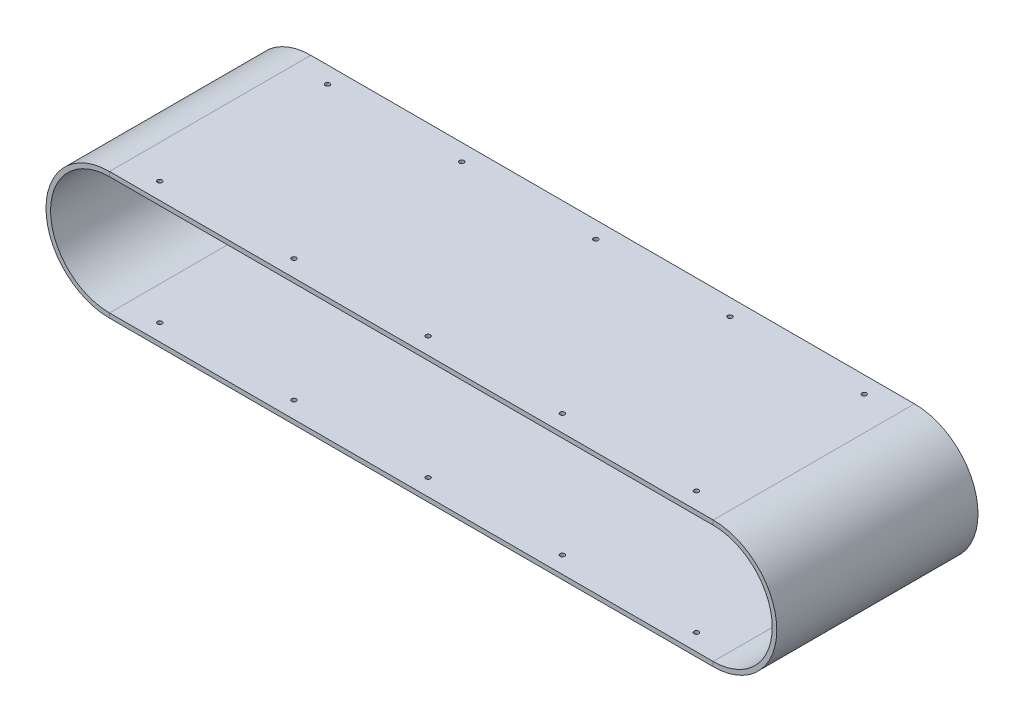
ISO-10303-21;
HEADER;
FILE_DESCRIPTION(('STEP AP214'),'2;1');
FILE_NAME('part.step','',(''),(''),'','','');
FILE_SCHEMA(('AUTOMOTIVE_DESIGN { 1 0 10303 214 1 1 1 1 }'));
ENDSEC;
DATA;
#1=APPLICATION_CONTEXT('core data for automotive mechanical design processes');
#2=APPLICATION_PROTOCOL_DEFINITION('international standard','automotive_design',2000,#1);
#3=PRODUCT_CONTEXT('',#1,'mechanical');
#4=PRODUCT('Part','Part','',(#3));
#5=PRODUCT_RELATED_PRODUCT_CATEGORY('part','',(#4));
#6=PRODUCT_DEFINITION_FORMATION('','',#4);
#7=PRODUCT_DEFINITION_CONTEXT('part definition',#1,'design');
#8=PRODUCT_DEFINITION('design','',#6,#7);
#9=PRODUCT_DEFINITION_SHAPE('','',#8);
#10=(LENGTH_UNIT() NAMED_UNIT(*) SI_UNIT(.MILLI.,.METRE.));
#11=(NAMED_UNIT(*) PLANE_ANGLE_UNIT() SI_UNIT($,.RADIAN.));
#12=(NAMED_UNIT(*) SI_UNIT($,.STERADIAN.) SOLID_ANGLE_UNIT());
#13=UNCERTAINTY_MEASURE_WITH_UNIT(LENGTH_MEASURE(1.E-05),#10,'distance_accuracy_value','');
#14=(GEOMETRIC_REPRESENTATION_CONTEXT(3) GLOBAL_UNCERTAINTY_ASSIGNED_CONTEXT((#13)) GLOBAL_UNIT_ASSIGNED_CONTEXT((#10,
#11,#12)) REPRESENTATION_CONTEXT('',''));
#15=CARTESIAN_POINT('',(0.,0.,0.));
#16=DIRECTION('',(0.,0.,1.));
#17=DIRECTION('',(1.,0.,0.));
#18=AXIS2_PLACEMENT_3D('',#15,#16,#17);
#19=CARTESIAN_POINT('',(0.,0.,0.));
#20=DIRECTION('',(0.,0.,-1.));
#21=DIRECTION('',(-1.,0.,0.));
#22=AXIS2_PLACEMENT_3D('',#19,#20,#21);
#23=CYLINDRICAL_SURFACE('',#22,44.68495);
#24=CARTESIAN_POINT('',(0.,0.,76.2));
#25=DIRECTION('',(0.,0.,-1.));
#26=DIRECTION('',(0.,-1.,0.));
#27=AXIS2_PLACEMENT_3D('',#24,#25,#26);
#28=CIRCLE('',#27,44.68495);
#29=CARTESIAN_POINT('',(0.,-44.68495,76.2));
#30=VERTEX_POINT('',#29);
#31=CARTESIAN_POINT('',(0.,44.68495,76.2));
#32=VERTEX_POINT('',#31);
#33=EDGE_CURVE('E11',#30,#32,#28,.T.);
#34=ORIENTED_EDGE('',*,*,#33,.F.);
#35=DIRECTION('',(0.,0.,-1.));
#36=VECTOR('',#35,1.);
#37=CARTESIAN_POINT('',(0.,-44.68495,76.2));
#38=LINE('',#37,#36);
#39=CARTESIAN_POINT('',(0.,-44.68495,-76.2));
#40=VERTEX_POINT('',#39);
#41=EDGE_CURVE('E38',#30,#40,#38,.T.);
#42=ORIENTED_EDGE('',*,*,#41,.T.);
#43=CARTESIAN_POINT('',(0.,0.,-76.2));
#44=DIRECTION('',(0.,0.,-1.));
#45=DIRECTION('',(0.,-1.,0.));
#46=AXIS2_PLACEMENT_3D('',#43,#44,#45);
#47=CIRCLE('',#46,44.68495);
#48=CARTESIAN_POINT('',(0.,44.68495,-76.2));
#49=VERTEX_POINT('',#48);
#50=EDGE_CURVE('E123',#40,#49,#47,.T.);
#51=ORIENTED_EDGE('',*,*,#50,.T.);
#52=DIRECTION('',(0.,0.,-1.));
#53=VECTOR('',#52,1.);
#54=CARTESIAN_POINT('',(0.,44.68495,76.2));
#55=LINE('',#54,#53);
#56=EDGE_CURVE('E126',#32,#49,#55,.T.);
#57=ORIENTED_EDGE('',*,*,#56,.F.);
#58=EDGE_LOOP('',(#34,#42,#51,#57));
#59=FACE_BOUND('',#58,.T.);
#60=ADVANCED_FACE('F35',(#59),#23,.F.);
#61=CARTESIAN_POINT('',(0.,-44.68495,76.2));
#62=DIRECTION('',(0.,0.,1.));
#63=DIRECTION('',(1.,0.,0.));
#64=AXIS2_PLACEMENT_3D('',#61,#62,#63);
#65=PLANE('',#64);
#66=CARTESIAN_POINT('',(0.,0.,76.2));
#67=DIRECTION('',(0.,0.,-1.));
#68=DIRECTION('',(0.,-1.,0.));
#69=AXIS2_PLACEMENT_3D('',#66,#67,#68);
#70=CIRCLE('',#69,48.11395);
#71=CARTESIAN_POINT('',(0.,-48.11395,76.2));
#72=VERTEX_POINT('',#71);
#73=CARTESIAN_POINT('',(0.,48.11395,76.2));
#74=VERTEX_POINT('',#73);
#75=EDGE_CURVE('E43',#72,#74,#70,.T.);
#76=ORIENTED_EDGE('',*,*,#75,.F.);
#77=DIRECTION('',(0.,1.,0.));
#78=VECTOR('',#77,1.);
#79=CARTESIAN_POINT('',(0.,-44.68495,76.2));
#80=LINE('',#79,#78);
#81=EDGE_CURVE('E198',#72,#30,#80,.T.);
#82=ORIENTED_EDGE('',*,*,#81,.T.);
#83=ORIENTED_EDGE('',*,*,#33,.T.);
#84=DIRECTION('',(0.,-1.,0.));
#85=VECTOR('',#84,1.);
#86=CARTESIAN_POINT('',(0.,44.68495,76.2));
#87=LINE('',#86,#85);
#88=EDGE_CURVE('E151',#74,#32,#87,.T.);
#89=ORIENTED_EDGE('',*,*,#88,.F.);
#90=EDGE_LOOP('',(#76,#82,#83,#89));
#91=FACE_BOUND('',#90,.T.);
#92=ADVANCED_FACE('F222',(#91),#65,.T.);
#93=CARTESIAN_POINT('',(0.,0.,0.));
#94=DIRECTION('',(0.,0.,-1.));
#95=DIRECTION('',(-1.,0.,0.));
#96=AXIS2_PLACEMENT_3D('',#93,#94,#95);
#97=CYLINDRICAL_SURFACE('',#96,48.11395);
#98=CARTESIAN_POINT('',(0.,0.,-76.2));
#99=DIRECTION('',(0.,0.,-1.));
#100=DIRECTION('',(0.,-1.,0.));
#101=AXIS2_PLACEMENT_3D('',#98,#99,#100);
#102=CIRCLE('',#101,48.11395);
#103=CARTESIAN_POINT('',(0.,-48.11395,-76.2));
#104=VERTEX_POINT('',#103);
#105=CARTESIAN_POINT('',(0.,48.11395,-76.2));
#106=VERTEX_POINT('',#105);
#107=EDGE_CURVE('E132',#104,#106,#102,.T.);
#108=ORIENTED_EDGE('',*,*,#107,.F.);
#109=DIRECTION('',(0.,0.,1.));
#110=VECTOR('',#109,1.);
#111=CARTESIAN_POINT('',(0.,-48.11395,76.2));
#112=LINE('',#111,#110);
#113=EDGE_CURVE('E182',#104,#72,#112,.T.);
#114=ORIENTED_EDGE('',*,*,#113,.T.);
#115=ORIENTED_EDGE('',*,*,#75,.T.);
#116=DIRECTION('',(0.,0.,1.));
#117=VECTOR('',#116,1.);
#118=CARTESIAN_POINT('',(0.,48.11395,76.2));
#119=LINE('',#118,#117);
#120=EDGE_CURVE('E155',#106,#74,#119,.T.);
#121=ORIENTED_EDGE('',*,*,#120,.F.);
#122=EDGE_LOOP('',(#108,#114,#115,#121));
#123=FACE_BOUND('',#122,.T.);
#124=ADVANCED_FACE('F227',(#123),#97,.T.);
#125=CARTESIAN_POINT('',(457.2,-44.6849500000001,76.2));
#126=DIRECTION('',(0.,1.,0.));
#127=DIRECTION('',(-1.,0.,0.));
#128=AXIS2_PLACEMENT_3D('',#125,#126,#127);
#129=PLANE('',#128);
#130=CARTESIAN_POINT('',(228.6,-44.68495,-63.5));
#131=DIRECTION('',(0.,1.,0.));
#132=DIRECTION('',(-1.,0.,0.));
#133=AXIS2_PLACEMENT_3D('',#130,#131,#132);
#134=CIRCLE('',#133,1.75000000000001);
#135=CARTESIAN_POINT('',(226.85,-44.68495,-63.5));
#136=VERTEX_POINT('',#135);
#137=EDGE_CURVE('E156',#136,#136,#134,.T.);
#138=ORIENTED_EDGE('',*,*,#137,.F.);
#139=EDGE_LOOP('',(#138));
#140=FACE_BOUND('',#139,.T.);
#141=CARTESIAN_POINT('',(330.2,-44.68495,63.4999999999999));
#142=DIRECTION('',(0.,1.,0.));
#143=DIRECTION('',(-1.,0.,0.));
#144=AXIS2_PLACEMENT_3D('',#141,#142,#143);
#145=CIRCLE('',#144,1.75000000000004);
#146=CARTESIAN_POINT('',(328.45,-44.68495,63.4999999999999));
#147=VERTEX_POINT('',#146);
#148=EDGE_CURVE('E265',#147,#147,#145,.T.);
#149=ORIENTED_EDGE('',*,*,#148,.F.);
#150=EDGE_LOOP('',(#149));
#151=FACE_BOUND('',#150,.T.);
#152=CARTESIAN_POINT('',(330.2,-44.68495,-63.5));
#153=DIRECTION('',(0.,1.,0.));
#154=DIRECTION('',(-1.,0.,0.));
#155=AXIS2_PLACEMENT_3D('',#152,#153,#154);
#156=CIRCLE('',#155,1.74999999999998);
#157=CARTESIAN_POINT('',(328.45,-44.68495,-63.5));
#158=VERTEX_POINT('',#157);
#159=EDGE_CURVE('E269',#158,#158,#156,.T.);
#160=ORIENTED_EDGE('',*,*,#159,.F.);
#161=EDGE_LOOP('',(#160));
#162=FACE_BOUND('',#161,.T.);
#163=CARTESIAN_POINT('',(431.8,-44.6849500000001,63.4999999999999));
#164=DIRECTION('',(0.,1.,0.));
#165=DIRECTION('',(-1.,0.,0.));
#166=AXIS2_PLACEMENT_3D('',#163,#164,#165);
#167=CIRCLE('',#166,1.75000000000004);
#168=CARTESIAN_POINT('',(430.05,-44.6849500000001,63.4999999999999));
#169=VERTEX_POINT('',#168);
#170=EDGE_CURVE('E273',#169,#169,#167,.T.);
#171=ORIENTED_EDGE('',*,*,#170,.F.);
#172=EDGE_LOOP('',(#171));
#173=FACE_BOUND('',#172,.T.);
#174=CARTESIAN_POINT('',(25.4,-44.68495,-63.5));
#175=DIRECTION('',(0.,1.,0.));
#176=DIRECTION('',(-1.,0.,0.));
#177=AXIS2_PLACEMENT_3D('',#174,#175,#176);
#178=CIRCLE('',#177,1.75);
#179=CARTESIAN_POINT('',(23.65,-44.68495,-63.5));
#180=VERTEX_POINT('',#179);
#181=EDGE_CURVE('E277',#180,#180,#178,.T.);
#182=ORIENTED_EDGE('',*,*,#181,.F.);
#183=EDGE_LOOP('',(#182));
#184=FACE_BOUND('',#183,.T.);
#185=CARTESIAN_POINT('',(127.,-44.68495,63.5));
#186=DIRECTION('',(0.,1.,0.));
#187=DIRECTION('',(-1.,0.,0.));
#188=AXIS2_PLACEMENT_3D('',#185,#186,#187);
#189=CIRCLE('',#188,1.75000000000001);
#190=CARTESIAN_POINT('',(125.25,-44.68495,63.5));
#191=VERTEX_POINT('',#190);
#192=EDGE_CURVE('E281',#191,#191,#189,.T.);
#193=ORIENTED_EDGE('',*,*,#192,.F.);
#194=EDGE_LOOP('',(#193));
#195=FACE_BOUND('',#194,.T.);
#196=CARTESIAN_POINT('',(127.,-44.68495,-63.5));
#197=DIRECTION('',(0.,1.,0.));
#198=DIRECTION('',(-1.,0.,0.));
#199=AXIS2_PLACEMENT_3D('',#196,#197,#198);
#200=CIRCLE('',#199,1.75000000000001);
#201=CARTESIAN_POINT('',(125.25,-44.68495,-63.5));
#202=VERTEX_POINT('',#201);
#203=EDGE_CURVE('E285',#202,#202,#200,.T.);
#204=ORIENTED_EDGE('',*,*,#203,.F.);
#205=EDGE_LOOP('',(#204));
#206=FACE_BOUND('',#205,.T.);
#207=CARTESIAN_POINT('',(228.6,-44.68495,63.5));
#208=DIRECTION('',(0.,1.,0.));
#209=DIRECTION('',(-1.,0.,0.));
#210=AXIS2_PLACEMENT_3D('',#207,#208,#209);
#211=CIRCLE('',#210,1.74999999999998);
#212=CARTESIAN_POINT('',(226.85,-44.68495,63.5));
#213=VERTEX_POINT('',#212);
#214=EDGE_CURVE('E289',#213,#213,#211,.T.);
#215=ORIENTED_EDGE('',*,*,#214,.F.);
#216=EDGE_LOOP('',(#215));
#217=FACE_BOUND('',#216,.T.);
#218=CARTESIAN_POINT('',(431.8,-44.6849500000001,-63.5));
#219=DIRECTION('',(0.,1.,0.));
#220=DIRECTION('',(-1.,0.,0.));
#221=AXIS2_PLACEMENT_3D('',#218,#219,#220);
#222=CIRCLE('',#221,1.74999999999998);
#223=CARTESIAN_POINT('',(430.05,-44.6849500000001,-63.5));
#224=VERTEX_POINT('',#223);
#225=EDGE_CURVE('E293',#224,#224,#222,.T.);
#226=ORIENTED_EDGE('',*,*,#225,.F.);
#227=EDGE_LOOP('',(#226));
#228=FACE_BOUND('',#227,.T.);
#229=CARTESIAN_POINT('',(25.4,-44.68495,63.5));
#230=DIRECTION('',(0.,1.,0.));
#231=DIRECTION('',(-1.,0.,0.));
#232=AXIS2_PLACEMENT_3D('',#229,#230,#231);
#233=CIRCLE('',#232,1.75);
#234=CARTESIAN_POINT('',(23.65,-44.68495,63.5));
#235=VERTEX_POINT('',#234);
#236=EDGE_CURVE('E296',#235,#235,#233,.T.);
#237=ORIENTED_EDGE('',*,*,#236,.F.);
#238=EDGE_LOOP('',(#237));
#239=FACE_BOUND('',#238,.T.);
#240=ORIENTED_EDGE('',*,*,#41,.F.);
#241=DIRECTION('',(-1.,0.,0.));
#242=VECTOR('',#241,1.);
#243=CARTESIAN_POINT('',(457.2,-44.6849500000001,76.2));
#244=LINE('',#243,#242);
#245=CARTESIAN_POINT('',(457.2,-44.68495,76.2));
#246=VERTEX_POINT('',#245);
#247=EDGE_CURVE('E79',#246,#30,#244,.T.);
#248=ORIENTED_EDGE('',*,*,#247,.F.);
#249=DIRECTION('',(0.,0.,-1.));
#250=VECTOR('',#249,1.);
#251=CARTESIAN_POINT('',(457.2,-44.68495,76.2));
#252=LINE('',#251,#250);
#253=CARTESIAN_POINT('',(457.2,-44.68495,-76.2));
#254=VERTEX_POINT('',#253);
#255=EDGE_CURVE('E185',#246,#254,#252,.T.);
#256=ORIENTED_EDGE('',*,*,#255,.T.);
#257=DIRECTION('',(-1.,0.,0.));
#258=VECTOR('',#257,1.);
#259=CARTESIAN_POINT('',(457.2,-44.6849500000001,-76.2));
#260=LINE('',#259,#258);
#261=EDGE_CURVE('E180',#254,#40,#260,.T.);
#262=ORIENTED_EDGE('',*,*,#261,.T.);
#263=EDGE_LOOP('',(#240,#248,#256,#262));
#264=FACE_BOUND('',#263,.T.);
#265=ADVANCED_FACE('F211',(#140,#151,#162,#173,#184,#195,#206,#217,#228,#239,#264),#129,.T.);
#266=CARTESIAN_POINT('',(457.2,-44.6849500000001,76.2));
#267=DIRECTION('',(0.,0.,1.));
#268=DIRECTION('',(1.,0.,0.));
#269=AXIS2_PLACEMENT_3D('',#266,#267,#268);
#270=PLANE('',#269);
#271=ORIENTED_EDGE('',*,*,#247,.T.);
#272=ORIENTED_EDGE('',*,*,#81,.F.);
#273=DIRECTION('',(-1.,0.,0.));
#274=VECTOR('',#273,1.);
#275=CARTESIAN_POINT('',(457.2,-48.1139500000001,76.2));
#276=LINE('',#275,#274);
#277=CARTESIAN_POINT('',(457.2,-48.11395,76.2));
#278=VERTEX_POINT('',#277);
#279=EDGE_CURVE('E88',#278,#72,#276,.T.);
#280=ORIENTED_EDGE('',*,*,#279,.F.);
#281=DIRECTION('',(0.,1.,0.));
#282=VECTOR('',#281,1.);
#283=CARTESIAN_POINT('',(457.2,-44.68495,76.2));
#284=LINE('',#283,#282);
#285=EDGE_CURVE('E194',#278,#246,#284,.T.);
#286=ORIENTED_EDGE('',*,*,#285,.T.);
#287=EDGE_LOOP('',(#271,#272,#280,#286));
#288=FACE_BOUND('',#287,.T.);
#289=ADVANCED_FACE('F221',(#288),#270,.T.);
#290=CARTESIAN_POINT('',(457.2,-48.1139500000001,76.2));
#291=DIRECTION('',(0.,-1.,0.));
#292=DIRECTION('',(1.,0.,0.));
#293=AXIS2_PLACEMENT_3D('',#290,#291,#292);
#294=PLANE('',#293);
#295=CARTESIAN_POINT('',(228.6,-48.11395,-63.5));
#296=DIRECTION('',(0.,1.,0.));
#297=DIRECTION('',(1.,0.,0.));
#298=AXIS2_PLACEMENT_3D('',#295,#296,#297);
#299=CIRCLE('',#298,1.75000000000001);
#300=CARTESIAN_POINT('',(230.35,-48.11395,-63.5));
#301=VERTEX_POINT('',#300);
#302=EDGE_CURVE('E390',#301,#301,#299,.T.);
#303=ORIENTED_EDGE('',*,*,#302,.T.);
#304=EDGE_LOOP('',(#303));
#305=FACE_BOUND('',#304,.T.);
#306=CARTESIAN_POINT('',(330.2,-48.11395,63.4999999999999));
#307=DIRECTION('',(0.,1.,0.));
#308=DIRECTION('',(-1.,0.,0.));
#309=AXIS2_PLACEMENT_3D('',#306,#307,#308);
#310=CIRCLE('',#309,1.75000000000004);
#311=CARTESIAN_POINT('',(328.45,-48.11395,63.4999999999999));
#312=VERTEX_POINT('',#311);
#313=EDGE_CURVE('E401',#312,#312,#310,.T.);
#314=ORIENTED_EDGE('',*,*,#313,.T.);
#315=EDGE_LOOP('',(#314));
#316=FACE_BOUND('',#315,.T.);
#317=CARTESIAN_POINT('',(330.2,-48.11395,-63.5));
#318=DIRECTION('',(0.,1.,0.));
#319=DIRECTION('',(1.,0.,0.));
#320=AXIS2_PLACEMENT_3D('',#317,#318,#319);
#321=CIRCLE('',#320,1.74999999999998);
#322=CARTESIAN_POINT('',(331.95,-48.11395,-63.5));
#323=VERTEX_POINT('',#322);
#324=EDGE_CURVE('E402',#323,#323,#321,.T.);
#325=ORIENTED_EDGE('',*,*,#324,.T.);
#326=EDGE_LOOP('',(#325));
#327=FACE_BOUND('',#326,.T.);
#328=CARTESIAN_POINT('',(431.8,-48.11395,63.4999999999999));
#329=DIRECTION('',(0.,1.,0.));
#330=DIRECTION('',(-1.,0.,0.));
#331=AXIS2_PLACEMENT_3D('',#328,#329,#330);
#332=CIRCLE('',#331,1.75000000000004);
#333=CARTESIAN_POINT('',(430.05,-48.11395,63.4999999999999));
#334=VERTEX_POINT('',#333);
#335=EDGE_CURVE('E413',#334,#334,#332,.T.);
#336=ORIENTED_EDGE('',*,*,#335,.T.);
#337=EDGE_LOOP('',(#336));
#338=FACE_BOUND('',#337,.T.);
#339=CARTESIAN_POINT('',(25.4,-48.1139500000001,-63.5));
#340=DIRECTION('',(0.,1.,0.));
#341=DIRECTION('',(1.,0.,0.));
#342=AXIS2_PLACEMENT_3D('',#339,#340,#341);
#343=CIRCLE('',#342,1.75);
#344=CARTESIAN_POINT('',(27.15,-48.1139500000001,-63.5));
#345=VERTEX_POINT('',#344);
#346=EDGE_CURVE('E370',#345,#345,#343,.T.);
#347=ORIENTED_EDGE('',*,*,#346,.T.);
#348=EDGE_LOOP('',(#347));
#349=FACE_BOUND('',#348,.T.);
#350=CARTESIAN_POINT('',(127.,-48.11395,63.5));
#351=DIRECTION('',(0.,1.,0.));
#352=DIRECTION('',(-1.,0.,0.));
#353=AXIS2_PLACEMENT_3D('',#350,#351,#352);
#354=CIRCLE('',#353,1.75000000000001);
#355=CARTESIAN_POINT('',(125.25,-48.11395,63.5));
#356=VERTEX_POINT('',#355);
#357=EDGE_CURVE('E380',#356,#356,#354,.T.);
#358=ORIENTED_EDGE('',*,*,#357,.T.);
#359=EDGE_LOOP('',(#358));
#360=FACE_BOUND('',#359,.T.);
#361=CARTESIAN_POINT('',(127.,-48.11395,-63.5));
#362=DIRECTION('',(0.,1.,0.));
#363=DIRECTION('',(1.,0.,0.));
#364=AXIS2_PLACEMENT_3D('',#361,#362,#363);
#365=CIRCLE('',#364,1.75000000000001);
#366=CARTESIAN_POINT('',(128.75,-48.11395,-63.5));
#367=VERTEX_POINT('',#366);
#368=EDGE_CURVE('E381',#367,#367,#365,.T.);
#369=ORIENTED_EDGE('',*,*,#368,.T.);
#370=EDGE_LOOP('',(#369));
#371=FACE_BOUND('',#370,.T.);
#372=CARTESIAN_POINT('',(228.6,-48.11395,63.5));
#373=DIRECTION('',(0.,1.,0.));
#374=DIRECTION('',(-1.,0.,0.));
#375=AXIS2_PLACEMENT_3D('',#372,#373,#374);
#376=CIRCLE('',#375,1.74999999999998);
#377=CARTESIAN_POINT('',(226.85,-48.11395,63.5));
#378=VERTEX_POINT('',#377);
#379=EDGE_CURVE('E389',#378,#378,#376,.T.);
#380=ORIENTED_EDGE('',*,*,#379,.T.);
#381=EDGE_LOOP('',(#380));
#382=FACE_BOUND('',#381,.T.);
#383=CARTESIAN_POINT('',(431.8,-48.11395,-63.5));
#384=DIRECTION('',(0.,1.,0.));
#385=DIRECTION('',(1.,0.,0.));
#386=AXIS2_PLACEMENT_3D('',#383,#384,#385);
#387=CIRCLE('',#386,1.74999999999998);
#388=CARTESIAN_POINT('',(433.55,-48.11395,-63.5));
#389=VERTEX_POINT('',#388);
#390=EDGE_CURVE('E414',#389,#389,#387,.T.);
#391=ORIENTED_EDGE('',*,*,#390,.T.);
#392=EDGE_LOOP('',(#391));
#393=FACE_BOUND('',#392,.T.);
#394=CARTESIAN_POINT('',(25.4,-48.1139500000001,63.5));
#395=DIRECTION('',(0.,1.,0.));
#396=DIRECTION('',(-1.,0.,0.));
#397=AXIS2_PLACEMENT_3D('',#394,#395,#396);
#398=CIRCLE('',#397,1.75);
#399=CARTESIAN_POINT('',(23.65,-48.1139500000001,63.5));
#400=VERTEX_POINT('',#399);
#401=EDGE_CURVE('E304',#400,#400,#398,.T.);
#402=ORIENTED_EDGE('',*,*,#401,.T.);
#403=EDGE_LOOP('',(#402));
#404=FACE_BOUND('',#403,.T.);
#405=ORIENTED_EDGE('',*,*,#279,.T.);
#406=ORIENTED_EDGE('',*,*,#113,.F.);
#407=DIRECTION('',(-1.,0.,0.));
#408=VECTOR('',#407,1.);
#409=CARTESIAN_POINT('',(457.2,-48.1139500000001,-76.2));
#410=LINE('',#409,#408);
#411=CARTESIAN_POINT('',(457.2,-48.11395,-76.2));
#412=VERTEX_POINT('',#411);
#413=EDGE_CURVE('E96',#412,#104,#410,.T.);
#414=ORIENTED_EDGE('',*,*,#413,.F.);
#415=DIRECTION('',(0.,0.,1.));
#416=VECTOR('',#415,1.);
#417=CARTESIAN_POINT('',(457.2,-48.11395,76.2));
#418=LINE('',#417,#416);
#419=EDGE_CURVE('E174',#412,#278,#418,.T.);
#420=ORIENTED_EDGE('',*,*,#419,.T.);
#421=EDGE_LOOP('',(#405,#406,#414,#420));
#422=FACE_BOUND('',#421,.T.);
#423=ADVANCED_FACE('F228',(#305,#316,#327,#338,#349,#360,#371,#382,#393,#404,#422),#294,.T.);
#424=CARTESIAN_POINT('',(457.2,-44.6849500000001,-76.2));
#425=DIRECTION('',(0.,0.,-1.));
#426=DIRECTION('',(-1.,0.,0.));
#427=AXIS2_PLACEMENT_3D('',#424,#425,#426);
#428=PLANE('',#427);
#429=ORIENTED_EDGE('',*,*,#413,.T.);
#430=DIRECTION('',(0.,-1.,0.));
#431=VECTOR('',#430,1.);
#432=CARTESIAN_POINT('',(0.,-44.68495,-76.2));
#433=LINE('',#432,#431);
#434=EDGE_CURVE('E178',#40,#104,#433,.T.);
#435=ORIENTED_EDGE('',*,*,#434,.F.);
#436=ORIENTED_EDGE('',*,*,#261,.F.);
#437=DIRECTION('',(0.,-1.,0.));
#438=VECTOR('',#437,1.);
#439=CARTESIAN_POINT('',(457.2,-44.68495,-76.2));
#440=LINE('',#439,#438);
#441=EDGE_CURVE('E169',#254,#412,#440,.T.);
#442=ORIENTED_EDGE('',*,*,#441,.T.);
#443=EDGE_LOOP('',(#429,#435,#436,#442));
#444=FACE_BOUND('',#443,.T.);
#445=ADVANCED_FACE('F229',(#444),#428,.T.);
#446=CARTESIAN_POINT('',(457.2,0.,0.));
#447=DIRECTION('',(0.,0.,-1.));
#448=DIRECTION('',(-1.,0.,0.));
#449=AXIS2_PLACEMENT_3D('',#446,#447,#448);
#450=CYLINDRICAL_SURFACE('',#449,44.6849500000001);
#451=ORIENTED_EDGE('',*,*,#255,.F.);
#452=CARTESIAN_POINT('',(457.2,0.,76.2));
#453=DIRECTION('',(0.,0.,-1.));
#454=DIRECTION('',(0.,1.,0.));
#455=AXIS2_PLACEMENT_3D('',#452,#453,#454);
#456=CIRCLE('',#455,44.6849500000001);
#457=CARTESIAN_POINT('',(457.2,44.6849500000001,76.2));
#458=VERTEX_POINT('',#457);
#459=EDGE_CURVE('E204',#458,#246,#456,.T.);
#460=ORIENTED_EDGE('',*,*,#459,.F.);
#461=DIRECTION('',(0.,0.,-1.));
#462=VECTOR('',#461,1.);
#463=CARTESIAN_POINT('',(457.2,44.6849500000001,76.2));
#464=LINE('',#463,#462);
#465=CARTESIAN_POINT('',(457.2,44.6849500000001,-76.2));
#466=VERTEX_POINT('',#465);
#467=EDGE_CURVE('E177',#458,#466,#464,.T.);
#468=ORIENTED_EDGE('',*,*,#467,.T.);
#469=CARTESIAN_POINT('',(457.2,0.,-76.2));
#470=DIRECTION('',(0.,0.,-1.));
#471=DIRECTION('',(0.,1.,0.));
#472=AXIS2_PLACEMENT_3D('',#469,#470,#471);
#473=CIRCLE('',#472,44.6849500000001);
#474=EDGE_CURVE('E172',#466,#254,#473,.T.);
#475=ORIENTED_EDGE('',*,*,#474,.T.);
#476=EDGE_LOOP('',(#451,#460,#468,#475));
#477=FACE_BOUND('',#476,.T.);
#478=ADVANCED_FACE('F216',(#477),#450,.F.);
#479=CARTESIAN_POINT('',(457.2,44.6849500000001,76.2));
#480=DIRECTION('',(0.,0.,1.));
#481=DIRECTION('',(1.,0.,0.));
#482=AXIS2_PLACEMENT_3D('',#479,#480,#481);
#483=PLANE('',#482);
#484=ORIENTED_EDGE('',*,*,#459,.T.);
#485=ORIENTED_EDGE('',*,*,#285,.F.);
#486=CARTESIAN_POINT('',(457.2,0.,76.2));
#487=DIRECTION('',(0.,0.,-1.));
#488=DIRECTION('',(0.,1.,0.));
#489=AXIS2_PLACEMENT_3D('',#486,#487,#488);
#490=CIRCLE('',#489,48.1139500000001);
#491=CARTESIAN_POINT('',(457.2,48.1139500000001,76.2));
#492=VERTEX_POINT('',#491);
#493=EDGE_CURVE('E108',#492,#278,#490,.T.);
#494=ORIENTED_EDGE('',*,*,#493,.F.);
#495=DIRECTION('',(0.,-1.,0.));
#496=VECTOR('',#495,1.);
#497=CARTESIAN_POINT('',(457.2,44.6849500000001,76.2));
#498=LINE('',#497,#496);
#499=EDGE_CURVE('E191',#492,#458,#498,.T.);
#500=ORIENTED_EDGE('',*,*,#499,.T.);
#501=EDGE_LOOP('',(#484,#485,#494,#500));
#502=FACE_BOUND('',#501,.T.);
#503=ADVANCED_FACE('F220',(#502),#483,.T.);
#504=CARTESIAN_POINT('',(457.2,0.,0.));
#505=DIRECTION('',(0.,0.,-1.));
#506=DIRECTION('',(-1.,0.,0.));
#507=AXIS2_PLACEMENT_3D('',#504,#505,#506);
#508=CYLINDRICAL_SURFACE('',#507,48.1139500000001);
#509=ORIENTED_EDGE('',*,*,#493,.T.);
#510=ORIENTED_EDGE('',*,*,#419,.F.);
#511=CARTESIAN_POINT('',(457.2,0.,-76.2));
#512=DIRECTION('',(0.,0.,-1.));
#513=DIRECTION('',(0.,1.,0.));
#514=AXIS2_PLACEMENT_3D('',#511,#512,#513);
#515=CIRCLE('',#514,48.1139500000001);
#516=CARTESIAN_POINT('',(457.2,48.1139500000001,-76.2));
#517=VERTEX_POINT('',#516);
#518=EDGE_CURVE('E114',#517,#412,#515,.T.);
#519=ORIENTED_EDGE('',*,*,#518,.F.);
#520=DIRECTION('',(0.,0.,1.));
#521=VECTOR('',#520,1.);
#522=CARTESIAN_POINT('',(457.2,48.1139500000001,76.2));
#523=LINE('',#522,#521);
#524=EDGE_CURVE('E167',#517,#492,#523,.T.);
#525=ORIENTED_EDGE('',*,*,#524,.T.);
#526=EDGE_LOOP('',(#509,#510,#519,#525));
#527=FACE_BOUND('',#526,.T.);
#528=ADVANCED_FACE('F466',(#527),#508,.T.);
#529=CARTESIAN_POINT('',(457.2,44.6849500000001,-76.2));
#530=DIRECTION('',(0.,0.,-1.));
#531=DIRECTION('',(-1.,0.,0.));
#532=AXIS2_PLACEMENT_3D('',#529,#530,#531);
#533=PLANE('',#532);
#534=ORIENTED_EDGE('',*,*,#518,.T.);
#535=ORIENTED_EDGE('',*,*,#441,.F.);
#536=ORIENTED_EDGE('',*,*,#474,.F.);
#537=DIRECTION('',(0.,1.,0.));
#538=VECTOR('',#537,1.);
#539=CARTESIAN_POINT('',(457.2,44.6849500000001,-76.2));
#540=LINE('',#539,#538);
#541=EDGE_CURVE('E143',#466,#517,#540,.T.);
#542=ORIENTED_EDGE('',*,*,#541,.T.);
#543=EDGE_LOOP('',(#534,#535,#536,#542));
#544=FACE_BOUND('',#543,.T.);
#545=ADVANCED_FACE('F214',(#544),#533,.T.);
#546=CARTESIAN_POINT('',(0.,44.68495,76.2));
#547=DIRECTION('',(0.,-1.,0.));
#548=DIRECTION('',(1.,0.,0.));
#549=AXIS2_PLACEMENT_3D('',#546,#547,#548);
#550=PLANE('',#549);
#551=CARTESIAN_POINT('',(228.6,44.68495,-63.5));
#552=DIRECTION('',(0.,-1.,0.));
#553=DIRECTION('',(1.,0.,0.));
#554=AXIS2_PLACEMENT_3D('',#551,#552,#553);
#555=CIRCLE('',#554,1.75000000000001);
#556=CARTESIAN_POINT('',(230.35,44.68495,-63.5));
#557=VERTEX_POINT('',#556);
#558=EDGE_CURVE('E161',#557,#557,#555,.T.);
#559=ORIENTED_EDGE('',*,*,#558,.F.);
#560=EDGE_LOOP('',(#559));
#561=FACE_BOUND('',#560,.T.);
#562=CARTESIAN_POINT('',(330.2,44.68495,63.4999999999999));
#563=DIRECTION('',(0.,-1.,0.));
#564=DIRECTION('',(1.,0.,0.));
#565=AXIS2_PLACEMENT_3D('',#562,#563,#564);
#566=CIRCLE('',#565,1.75000000000004);
#567=CARTESIAN_POINT('',(331.95,44.68495,63.4999999999999));
#568=VERTEX_POINT('',#567);
#569=EDGE_CURVE('E333',#568,#568,#566,.T.);
#570=ORIENTED_EDGE('',*,*,#569,.F.);
#571=EDGE_LOOP('',(#570));
#572=FACE_BOUND('',#571,.T.);
#573=CARTESIAN_POINT('',(330.2,44.68495,-63.5));
#574=DIRECTION('',(0.,-1.,0.));
#575=DIRECTION('',(1.,0.,0.));
#576=AXIS2_PLACEMENT_3D('',#573,#574,#575);
#577=CIRCLE('',#576,1.74999999999998);
#578=CARTESIAN_POINT('',(331.95,44.68495,-63.5));
#579=VERTEX_POINT('',#578);
#580=EDGE_CURVE('E329',#579,#579,#577,.T.);
#581=ORIENTED_EDGE('',*,*,#580,.F.);
#582=EDGE_LOOP('',(#581));
#583=FACE_BOUND('',#582,.T.);
#584=CARTESIAN_POINT('',(431.8,44.6849500000001,63.4999999999999));
#585=DIRECTION('',(0.,-1.,0.));
#586=DIRECTION('',(1.,0.,0.));
#587=AXIS2_PLACEMENT_3D('',#584,#585,#586);
#588=CIRCLE('',#587,1.75000000000004);
#589=CARTESIAN_POINT('',(433.55,44.6849500000001,63.4999999999999));
#590=VERTEX_POINT('',#589);
#591=EDGE_CURVE('E325',#590,#590,#588,.T.);
#592=ORIENTED_EDGE('',*,*,#591,.F.);
#593=EDGE_LOOP('',(#592));
#594=FACE_BOUND('',#593,.T.);
#595=CARTESIAN_POINT('',(25.4,44.68495,-63.5));
#596=DIRECTION('',(0.,-1.,0.));
#597=DIRECTION('',(1.,0.,0.));
#598=AXIS2_PLACEMENT_3D('',#595,#596,#597);
#599=CIRCLE('',#598,1.75);
#600=CARTESIAN_POINT('',(27.15,44.68495,-63.5));
#601=VERTEX_POINT('',#600);
#602=EDGE_CURVE('E321',#601,#601,#599,.T.);
#603=ORIENTED_EDGE('',*,*,#602,.F.);
#604=EDGE_LOOP('',(#603));
#605=FACE_BOUND('',#604,.T.);
#606=CARTESIAN_POINT('',(127.,44.68495,63.5));
#607=DIRECTION('',(0.,-1.,0.));
#608=DIRECTION('',(1.,0.,0.));
#609=AXIS2_PLACEMENT_3D('',#606,#607,#608);
#610=CIRCLE('',#609,1.75000000000001);
#611=CARTESIAN_POINT('',(128.75,44.68495,63.5));
#612=VERTEX_POINT('',#611);
#613=EDGE_CURVE('E317',#612,#612,#610,.T.);
#614=ORIENTED_EDGE('',*,*,#613,.F.);
#615=EDGE_LOOP('',(#614));
#616=FACE_BOUND('',#615,.T.);
#617=CARTESIAN_POINT('',(127.,44.68495,-63.5));
#618=DIRECTION('',(0.,-1.,0.));
#619=DIRECTION('',(1.,0.,0.));
#620=AXIS2_PLACEMENT_3D('',#617,#618,#619);
#621=CIRCLE('',#620,1.75000000000001);
#622=CARTESIAN_POINT('',(128.75,44.68495,-63.5));
#623=VERTEX_POINT('',#622);
#624=EDGE_CURVE('E313',#623,#623,#621,.T.);
#625=ORIENTED_EDGE('',*,*,#624,.F.);
#626=EDGE_LOOP('',(#625));
#627=FACE_BOUND('',#626,.T.);
#628=CARTESIAN_POINT('',(228.6,44.68495,63.5));
#629=DIRECTION('',(0.,-1.,0.));
#630=DIRECTION('',(1.,0.,0.));
#631=AXIS2_PLACEMENT_3D('',#628,#629,#630);
#632=CIRCLE('',#631,1.74999999999998);
#633=CARTESIAN_POINT('',(230.35,44.68495,63.5));
#634=VERTEX_POINT('',#633);
#635=EDGE_CURVE('E309',#634,#634,#632,.T.);
#636=ORIENTED_EDGE('',*,*,#635,.F.);
#637=EDGE_LOOP('',(#636));
#638=FACE_BOUND('',#637,.T.);
#639=CARTESIAN_POINT('',(431.8,44.6849500000001,-63.5));
#640=DIRECTION('',(0.,-1.,0.));
#641=DIRECTION('',(1.,0.,0.));
#642=AXIS2_PLACEMENT_3D('',#639,#640,#641);
#643=CIRCLE('',#642,1.74999999999998);
#644=CARTESIAN_POINT('',(433.55,44.6849500000001,-63.5));
#645=VERTEX_POINT('',#644);
#646=EDGE_CURVE('E298',#645,#645,#643,.T.);
#647=ORIENTED_EDGE('',*,*,#646,.F.);
#648=EDGE_LOOP('',(#647));
#649=FACE_BOUND('',#648,.T.);
#650=CARTESIAN_POINT('',(25.4,44.68495,63.5));
#651=DIRECTION('',(0.,-1.,0.));
#652=DIRECTION('',(1.,0.,0.));
#653=AXIS2_PLACEMENT_3D('',#650,#651,#652);
#654=CIRCLE('',#653,1.75);
#655=CARTESIAN_POINT('',(27.15,44.68495,63.5));
#656=VERTEX_POINT('',#655);
#657=EDGE_CURVE('E299',#656,#656,#654,.T.);
#658=ORIENTED_EDGE('',*,*,#657,.F.);
#659=EDGE_LOOP('',(#658));
#660=FACE_BOUND('',#659,.T.);
#661=ORIENTED_EDGE('',*,*,#467,.F.);
#662=DIRECTION('',(1.,0.,0.));
#663=VECTOR('',#662,1.);
#664=CARTESIAN_POINT('',(0.,44.68495,76.2));
#665=LINE('',#664,#663);
#666=EDGE_CURVE('E150',#32,#458,#665,.T.);
#667=ORIENTED_EDGE('',*,*,#666,.F.);
#668=ORIENTED_EDGE('',*,*,#56,.T.);
#669=DIRECTION('',(1.,0.,0.));
#670=VECTOR('',#669,1.);
#671=CARTESIAN_POINT('',(0.,44.68495,-76.2));
#672=LINE('',#671,#670);
#673=EDGE_CURVE('E138',#49,#466,#672,.T.);
#674=ORIENTED_EDGE('',*,*,#673,.T.);
#675=EDGE_LOOP('',(#661,#667,#668,#674));
#676=FACE_BOUND('',#675,.T.);
#677=ADVANCED_FACE('F148',(#561,#572,#583,#594,#605,#616,#627,#638,#649,#660,#676),#550,.T.);
#678=CARTESIAN_POINT('',(0.,44.68495,76.2));
#679=DIRECTION('',(0.,0.,1.));
#680=DIRECTION('',(1.,0.,0.));
#681=AXIS2_PLACEMENT_3D('',#678,#679,#680);
#682=PLANE('',#681);
#683=ORIENTED_EDGE('',*,*,#666,.T.);
#684=ORIENTED_EDGE('',*,*,#499,.F.);
#685=DIRECTION('',(1.,0.,0.));
#686=VECTOR('',#685,1.);
#687=CARTESIAN_POINT('',(0.,48.11395,76.2));
#688=LINE('',#687,#686);
#689=EDGE_CURVE('E188',#74,#492,#688,.T.);
#690=ORIENTED_EDGE('',*,*,#689,.F.);
#691=ORIENTED_EDGE('',*,*,#88,.T.);
#692=EDGE_LOOP('',(#683,#684,#690,#691));
#693=FACE_BOUND('',#692,.T.);
#694=ADVANCED_FACE('F218',(#693),#682,.T.);
#695=CARTESIAN_POINT('',(0.,48.11395,76.2));
#696=DIRECTION('',(0.,1.,0.));
#697=DIRECTION('',(-1.,0.,0.));
#698=AXIS2_PLACEMENT_3D('',#695,#696,#697);
#699=PLANE('',#698);
#700=CARTESIAN_POINT('',(228.6,48.11395,-63.5));
#701=DIRECTION('',(0.,1.,0.));
#702=DIRECTION('',(1.,0.,0.));
#703=AXIS2_PLACEMENT_3D('',#700,#701,#702);
#704=CIRCLE('',#703,1.75000000000001);
#705=CARTESIAN_POINT('',(230.35,48.11395,-63.5));
#706=VERTEX_POINT('',#705);
#707=EDGE_CURVE('E405',#706,#706,#704,.T.);
#708=ORIENTED_EDGE('',*,*,#707,.F.);
#709=EDGE_LOOP('',(#708));
#710=FACE_BOUND('',#709,.T.);
#711=CARTESIAN_POINT('',(330.2,48.11395,63.4999999999999));
#712=DIRECTION('',(0.,1.,0.));
#713=DIRECTION('',(-1.,0.,0.));
#714=AXIS2_PLACEMENT_3D('',#711,#712,#713);
#715=CIRCLE('',#714,1.75000000000004);
#716=CARTESIAN_POINT('',(328.45,48.11395,63.4999999999999));
#717=VERTEX_POINT('',#716);
#718=EDGE_CURVE('E398',#717,#717,#715,.T.);
#719=ORIENTED_EDGE('',*,*,#718,.F.);
#720=EDGE_LOOP('',(#719));
#721=FACE_BOUND('',#720,.T.);
#722=CARTESIAN_POINT('',(330.2,48.11395,-63.5));
#723=DIRECTION('',(0.,1.,0.));
#724=DIRECTION('',(1.,0.,0.));
#725=AXIS2_PLACEMENT_3D('',#722,#723,#724);
#726=CIRCLE('',#725,1.74999999999998);
#727=CARTESIAN_POINT('',(331.95,48.11395,-63.5));
#728=VERTEX_POINT('',#727);
#729=EDGE_CURVE('E417',#728,#728,#726,.T.);
#730=ORIENTED_EDGE('',*,*,#729,.F.);
#731=EDGE_LOOP('',(#730));
#732=FACE_BOUND('',#731,.T.);
#733=CARTESIAN_POINT('',(431.8,48.1139500000001,63.4999999999999));
#734=DIRECTION('',(0.,1.,0.));
#735=DIRECTION('',(-1.,0.,0.));
#736=AXIS2_PLACEMENT_3D('',#733,#734,#735);
#737=CIRCLE('',#736,1.75000000000004);
#738=CARTESIAN_POINT('',(430.05,48.1139500000001,63.4999999999999));
#739=VERTEX_POINT('',#738);
#740=EDGE_CURVE('E410',#739,#739,#737,.T.);
#741=ORIENTED_EDGE('',*,*,#740,.F.);
#742=EDGE_LOOP('',(#741));
#743=FACE_BOUND('',#742,.T.);
#744=CARTESIAN_POINT('',(25.4,48.11395,-63.5));
#745=DIRECTION('',(0.,1.,0.));
#746=DIRECTION('',(1.,0.,0.));
#747=AXIS2_PLACEMENT_3D('',#744,#745,#746);
#748=CIRCLE('',#747,1.75);
#749=CARTESIAN_POINT('',(27.15,48.11395,-63.5));
#750=VERTEX_POINT('',#749);
#751=EDGE_CURVE('E374',#750,#750,#748,.T.);
#752=ORIENTED_EDGE('',*,*,#751,.F.);
#753=EDGE_LOOP('',(#752));
#754=FACE_BOUND('',#753,.T.);
#755=CARTESIAN_POINT('',(127.,48.11395,63.5));
#756=DIRECTION('',(0.,1.,0.));
#757=DIRECTION('',(-1.,0.,0.));
#758=AXIS2_PLACEMENT_3D('',#755,#756,#757);
#759=CIRCLE('',#758,1.75000000000001);
#760=CARTESIAN_POINT('',(125.25,48.11395,63.5));
#761=VERTEX_POINT('',#760);
#762=EDGE_CURVE('E377',#761,#761,#759,.T.);
#763=ORIENTED_EDGE('',*,*,#762,.F.);
#764=EDGE_LOOP('',(#763));
#765=FACE_BOUND('',#764,.T.);
#766=CARTESIAN_POINT('',(127.,48.11395,-63.5));
#767=DIRECTION('',(0.,1.,0.));
#768=DIRECTION('',(1.,0.,0.));
#769=AXIS2_PLACEMENT_3D('',#766,#767,#768);
#770=CIRCLE('',#769,1.75000000000001);
#771=CARTESIAN_POINT('',(128.75,48.11395,-63.5));
#772=VERTEX_POINT('',#771);
#773=EDGE_CURVE('E393',#772,#772,#770,.T.);
#774=ORIENTED_EDGE('',*,*,#773,.F.);
#775=EDGE_LOOP('',(#774));
#776=FACE_BOUND('',#775,.T.);
#777=CARTESIAN_POINT('',(228.6,48.11395,63.5));
#778=DIRECTION('',(0.,1.,0.));
#779=DIRECTION('',(-1.,0.,0.));
#780=AXIS2_PLACEMENT_3D('',#777,#778,#779);
#781=CIRCLE('',#780,1.74999999999998);
#782=CARTESIAN_POINT('',(226.85,48.11395,63.5));
#783=VERTEX_POINT('',#782);
#784=EDGE_CURVE('E386',#783,#783,#781,.T.);
#785=ORIENTED_EDGE('',*,*,#784,.F.);
#786=EDGE_LOOP('',(#785));
#787=FACE_BOUND('',#786,.T.);
#788=CARTESIAN_POINT('',(431.8,48.1139500000001,-63.5));
#789=DIRECTION('',(0.,1.,0.));
#790=DIRECTION('',(1.,0.,0.));
#791=AXIS2_PLACEMENT_3D('',#788,#789,#790);
#792=CIRCLE('',#791,1.74999999999998);
#793=CARTESIAN_POINT('',(433.55,48.1139500000001,-63.5));
#794=VERTEX_POINT('',#793);
#795=EDGE_CURVE('E422',#794,#794,#792,.T.);
#796=ORIENTED_EDGE('',*,*,#795,.F.);
#797=EDGE_LOOP('',(#796));
#798=FACE_BOUND('',#797,.T.);
#799=CARTESIAN_POINT('',(25.4,48.11395,63.5));
#800=DIRECTION('',(0.,1.,0.));
#801=DIRECTION('',(-1.,0.,0.));
#802=AXIS2_PLACEMENT_3D('',#799,#800,#801);
#803=CIRCLE('',#802,1.75);
#804=CARTESIAN_POINT('',(23.65,48.11395,63.5));
#805=VERTEX_POINT('',#804);
#806=EDGE_CURVE('E368',#805,#805,#803,.T.);
#807=ORIENTED_EDGE('',*,*,#806,.F.);
#808=EDGE_LOOP('',(#807));
#809=FACE_BOUND('',#808,.T.);
#810=ORIENTED_EDGE('',*,*,#689,.T.);
#811=ORIENTED_EDGE('',*,*,#524,.F.);
#812=DIRECTION('',(1.,0.,0.));
#813=VECTOR('',#812,1.);
#814=CARTESIAN_POINT('',(0.,48.11395,-76.2));
#815=LINE('',#814,#813);
#816=EDGE_CURVE('E166',#106,#517,#815,.T.);
#817=ORIENTED_EDGE('',*,*,#816,.F.);
#818=ORIENTED_EDGE('',*,*,#120,.T.);
#819=EDGE_LOOP('',(#810,#811,#817,#818));
#820=FACE_BOUND('',#819,.T.);
#821=ADVANCED_FACE('F225',(#710,#721,#732,#743,#754,#765,#776,#787,#798,#809,#820),#699,.T.);
#822=CARTESIAN_POINT('',(0.,44.68495,-76.2));
#823=DIRECTION('',(0.,0.,-1.));
#824=DIRECTION('',(-1.,0.,0.));
#825=AXIS2_PLACEMENT_3D('',#822,#823,#824);
#826=PLANE('',#825);
#827=ORIENTED_EDGE('',*,*,#816,.T.);
#828=ORIENTED_EDGE('',*,*,#541,.F.);
#829=ORIENTED_EDGE('',*,*,#673,.F.);
#830=DIRECTION('',(0.,1.,0.));
#831=VECTOR('',#830,1.);
#832=CARTESIAN_POINT('',(0.,44.68495,-76.2));
#833=LINE('',#832,#831);
#834=EDGE_CURVE('E141',#49,#106,#833,.T.);
#835=ORIENTED_EDGE('',*,*,#834,.T.);
#836=EDGE_LOOP('',(#827,#828,#829,#835));
#837=FACE_BOUND('',#836,.T.);
#838=ADVANCED_FACE('F140',(#837),#826,.T.);
#839=CARTESIAN_POINT('',(0.,-44.68495,-76.2));
#840=DIRECTION('',(0.,0.,-1.));
#841=DIRECTION('',(-1.,0.,0.));
#842=AXIS2_PLACEMENT_3D('',#839,#840,#841);
#843=PLANE('',#842);
#844=ORIENTED_EDGE('',*,*,#434,.T.);
#845=ORIENTED_EDGE('',*,*,#107,.T.);
#846=ORIENTED_EDGE('',*,*,#834,.F.);
#847=ORIENTED_EDGE('',*,*,#50,.F.);
#848=EDGE_LOOP('',(#844,#845,#846,#847));
#849=FACE_BOUND('',#848,.T.);
#850=ADVANCED_FACE('F153',(#849),#843,.T.);
#851=CARTESIAN_POINT('',(25.4,-48.1139500000001,63.5));
#852=DIRECTION('',(0.,1.,0.));
#853=DIRECTION('',(-1.,0.,0.));
#854=AXIS2_PLACEMENT_3D('',#851,#852,#853);
#855=CYLINDRICAL_SURFACE('',#854,1.75);
#856=ORIENTED_EDGE('',*,*,#657,.T.);
#857=EDGE_LOOP('',(#856));
#858=FACE_BOUND('',#857,.T.);
#859=ORIENTED_EDGE('',*,*,#806,.T.);
#860=EDGE_LOOP('',(#859));
#861=FACE_BOUND('',#860,.T.);
#862=ADVANCED_FACE('F360',(#858,#861),#855,.F.);
#863=CARTESIAN_POINT('',(431.8,-48.11395,-63.5));
#864=DIRECTION('',(0.,1.,0.));
#865=DIRECTION('',(-1.,0.,0.));
#866=AXIS2_PLACEMENT_3D('',#863,#864,#865);
#867=CYLINDRICAL_SURFACE('',#866,1.74999999999998);
#868=ORIENTED_EDGE('',*,*,#646,.T.);
#869=EDGE_LOOP('',(#868));
#870=FACE_BOUND('',#869,.T.);
#871=ORIENTED_EDGE('',*,*,#795,.T.);
#872=EDGE_LOOP('',(#871));
#873=FACE_BOUND('',#872,.T.);
#874=ADVANCED_FACE('F363',(#870,#873),#867,.F.);
#875=CARTESIAN_POINT('',(228.6,-48.11395,63.5));
#876=DIRECTION('',(0.,1.,0.));
#877=DIRECTION('',(-1.,0.,0.));
#878=AXIS2_PLACEMENT_3D('',#875,#876,#877);
#879=CYLINDRICAL_SURFACE('',#878,1.74999999999998);
#880=ORIENTED_EDGE('',*,*,#635,.T.);
#881=EDGE_LOOP('',(#880));
#882=FACE_BOUND('',#881,.T.);
#883=ORIENTED_EDGE('',*,*,#784,.T.);
#884=EDGE_LOOP('',(#883));
#885=FACE_BOUND('',#884,.T.);
#886=ADVANCED_FACE('F442',(#882,#885),#879,.F.);
#887=CARTESIAN_POINT('',(127.,-48.11395,-63.5));
#888=DIRECTION('',(0.,1.,0.));
#889=DIRECTION('',(-1.,0.,0.));
#890=AXIS2_PLACEMENT_3D('',#887,#888,#889);
#891=CYLINDRICAL_SURFACE('',#890,1.75000000000001);
#892=ORIENTED_EDGE('',*,*,#624,.T.);
#893=EDGE_LOOP('',(#892));
#894=FACE_BOUND('',#893,.T.);
#895=ORIENTED_EDGE('',*,*,#773,.T.);
#896=EDGE_LOOP('',(#895));
#897=FACE_BOUND('',#896,.T.);
#898=ADVANCED_FACE('F449',(#894,#897),#891,.F.);
#899=CARTESIAN_POINT('',(127.,-48.11395,63.5));
#900=DIRECTION('',(0.,1.,0.));
#901=DIRECTION('',(-1.,0.,0.));
#902=AXIS2_PLACEMENT_3D('',#899,#900,#901);
#903=CYLINDRICAL_SURFACE('',#902,1.75000000000001);
#904=ORIENTED_EDGE('',*,*,#613,.T.);
#905=EDGE_LOOP('',(#904));
#906=FACE_BOUND('',#905,.T.);
#907=ORIENTED_EDGE('',*,*,#762,.T.);
#908=EDGE_LOOP('',(#907));
#909=FACE_BOUND('',#908,.T.);
#910=ADVANCED_FACE('F576',(#906,#909),#903,.F.);
#911=CARTESIAN_POINT('',(25.4,-48.1139500000001,-63.5));
#912=DIRECTION('',(0.,1.,0.));
#913=DIRECTION('',(-1.,0.,0.));
#914=AXIS2_PLACEMENT_3D('',#911,#912,#913);
#915=CYLINDRICAL_SURFACE('',#914,1.75);
#916=ORIENTED_EDGE('',*,*,#602,.T.);
#917=EDGE_LOOP('',(#916));
#918=FACE_BOUND('',#917,.T.);
#919=ORIENTED_EDGE('',*,*,#751,.T.);
#920=EDGE_LOOP('',(#919));
#921=FACE_BOUND('',#920,.T.);
#922=ADVANCED_FACE('F586',(#918,#921),#915,.F.);
#923=CARTESIAN_POINT('',(431.8,-48.11395,63.4999999999999));
#924=DIRECTION('',(0.,1.,0.));
#925=DIRECTION('',(-1.,0.,0.));
#926=AXIS2_PLACEMENT_3D('',#923,#924,#925);
#927=CYLINDRICAL_SURFACE('',#926,1.75000000000004);
#928=ORIENTED_EDGE('',*,*,#591,.T.);
#929=EDGE_LOOP('',(#928));
#930=FACE_BOUND('',#929,.T.);
#931=ORIENTED_EDGE('',*,*,#740,.T.);
#932=EDGE_LOOP('',(#931));
#933=FACE_BOUND('',#932,.T.);
#934=ADVANCED_FACE('F597',(#930,#933),#927,.F.);
#935=CARTESIAN_POINT('',(330.2,-48.11395,-63.5));
#936=DIRECTION('',(0.,1.,0.));
#937=DIRECTION('',(-1.,0.,0.));
#938=AXIS2_PLACEMENT_3D('',#935,#936,#937);
#939=CYLINDRICAL_SURFACE('',#938,1.74999999999998);
#940=ORIENTED_EDGE('',*,*,#580,.T.);
#941=EDGE_LOOP('',(#940));
#942=FACE_BOUND('',#941,.T.);
#943=ORIENTED_EDGE('',*,*,#729,.T.);
#944=EDGE_LOOP('',(#943));
#945=FACE_BOUND('',#944,.T.);
#946=ADVANCED_FACE('F608',(#942,#945),#939,.F.);
#947=CARTESIAN_POINT('',(330.2,-48.11395,63.4999999999999));
#948=DIRECTION('',(0.,1.,0.));
#949=DIRECTION('',(-1.,0.,0.));
#950=AXIS2_PLACEMENT_3D('',#947,#948,#949);
#951=CYLINDRICAL_SURFACE('',#950,1.75000000000004);
#952=ORIENTED_EDGE('',*,*,#569,.T.);
#953=EDGE_LOOP('',(#952));
#954=FACE_BOUND('',#953,.T.);
#955=ORIENTED_EDGE('',*,*,#718,.T.);
#956=EDGE_LOOP('',(#955));
#957=FACE_BOUND('',#956,.T.);
#958=ADVANCED_FACE('F619',(#954,#957),#951,.F.);
#959=CARTESIAN_POINT('',(228.6,-48.11395,-63.5));
#960=DIRECTION('',(0.,1.,0.));
#961=DIRECTION('',(-1.,0.,0.));
#962=AXIS2_PLACEMENT_3D('',#959,#960,#961);
#963=CYLINDRICAL_SURFACE('',#962,1.75000000000001);
#964=ORIENTED_EDGE('',*,*,#558,.T.);
#965=EDGE_LOOP('',(#964));
#966=FACE_BOUND('',#965,.T.);
#967=ORIENTED_EDGE('',*,*,#707,.T.);
#968=EDGE_LOOP('',(#967));
#969=FACE_BOUND('',#968,.T.);
#970=ADVANCED_FACE('F339',(#966,#969),#963,.F.);
#971=ORIENTED_EDGE('',*,*,#236,.T.);
#972=EDGE_LOOP('',(#971));
#973=FACE_BOUND('',#972,.T.);
#974=ORIENTED_EDGE('',*,*,#401,.F.);
#975=EDGE_LOOP('',(#974));
#976=FACE_BOUND('',#975,.T.);
#977=ADVANCED_FACE('F365',(#973,#976),#855,.F.);
#978=ORIENTED_EDGE('',*,*,#225,.T.);
#979=EDGE_LOOP('',(#978));
#980=FACE_BOUND('',#979,.T.);
#981=ORIENTED_EDGE('',*,*,#390,.F.);
#982=EDGE_LOOP('',(#981));
#983=FACE_BOUND('',#982,.T.);
#984=ADVANCED_FACE('F430',(#980,#983),#867,.F.);
#985=ORIENTED_EDGE('',*,*,#214,.T.);
#986=EDGE_LOOP('',(#985));
#987=FACE_BOUND('',#986,.T.);
#988=ORIENTED_EDGE('',*,*,#379,.F.);
#989=EDGE_LOOP('',(#988));
#990=FACE_BOUND('',#989,.T.);
#991=ADVANCED_FACE('F432',(#987,#990),#879,.F.);
#992=ORIENTED_EDGE('',*,*,#203,.T.);
#993=EDGE_LOOP('',(#992));
#994=FACE_BOUND('',#993,.T.);
#995=ORIENTED_EDGE('',*,*,#368,.F.);
#996=EDGE_LOOP('',(#995));
#997=FACE_BOUND('',#996,.T.);
#998=ADVANCED_FACE('F439',(#994,#997),#891,.F.);
#999=ORIENTED_EDGE('',*,*,#192,.T.);
#1000=EDGE_LOOP('',(#999));
#1001=FACE_BOUND('',#1000,.T.);
#1002=ORIENTED_EDGE('',*,*,#357,.F.);
#1003=EDGE_LOOP('',(#1002));
#1004=FACE_BOUND('',#1003,.T.);
#1005=ADVANCED_FACE('F589',(#1001,#1004),#903,.F.);
#1006=ORIENTED_EDGE('',*,*,#181,.T.);
#1007=EDGE_LOOP('',(#1006));
#1008=FACE_BOUND('',#1007,.T.);
#1009=ORIENTED_EDGE('',*,*,#346,.F.);
#1010=EDGE_LOOP('',(#1009));
#1011=FACE_BOUND('',#1010,.T.);
#1012=ADVANCED_FACE('F600',(#1008,#1011),#915,.F.);
#1013=ORIENTED_EDGE('',*,*,#170,.T.);
#1014=EDGE_LOOP('',(#1013));
#1015=FACE_BOUND('',#1014,.T.);
#1016=ORIENTED_EDGE('',*,*,#335,.F.);
#1017=EDGE_LOOP('',(#1016));
#1018=FACE_BOUND('',#1017,.T.);
#1019=ADVANCED_FACE('F611',(#1015,#1018),#927,.F.);
#1020=ORIENTED_EDGE('',*,*,#159,.T.);
#1021=EDGE_LOOP('',(#1020));
#1022=FACE_BOUND('',#1021,.T.);
#1023=ORIENTED_EDGE('',*,*,#324,.F.);
#1024=EDGE_LOOP('',(#1023));
#1025=FACE_BOUND('',#1024,.T.);
#1026=ADVANCED_FACE('F621',(#1022,#1025),#939,.F.);
#1027=ORIENTED_EDGE('',*,*,#148,.T.);
#1028=EDGE_LOOP('',(#1027));
#1029=FACE_BOUND('',#1028,.T.);
#1030=ORIENTED_EDGE('',*,*,#313,.F.);
#1031=EDGE_LOOP('',(#1030));
#1032=FACE_BOUND('',#1031,.T.);
#1033=ADVANCED_FACE('F631',(#1029,#1032),#951,.F.);
#1034=ORIENTED_EDGE('',*,*,#137,.T.);
#1035=EDGE_LOOP('',(#1034));
#1036=FACE_BOUND('',#1035,.T.);
#1037=ORIENTED_EDGE('',*,*,#302,.F.);
#1038=EDGE_LOOP('',(#1037));
#1039=FACE_BOUND('',#1038,.T.);
#1040=ADVANCED_FACE('F640',(#1036,#1039),#963,.F.);
#1041=CLOSED_SHELL('',(#60,#92,#124,#265,#289,#423,#445,#478,#503,#528,#545,#677,#694,#821,#838,
#850,#862,#874,#886,#898,#910,#922,#934,#946,#958,#970,#977,#984,#991,#998,#1005,#1012,#1019,
#1026,#1033,#1040));
#1042=MANIFOLD_SOLID_BREP('B2',#1041);
#1043=ADVANCED_BREP_SHAPE_REPRESENTATION('',(#18,#1042),#14);
#1044=SHAPE_DEFINITION_REPRESENTATION(#9,#1043);
ENDSEC;
END-ISO-10303-21;
